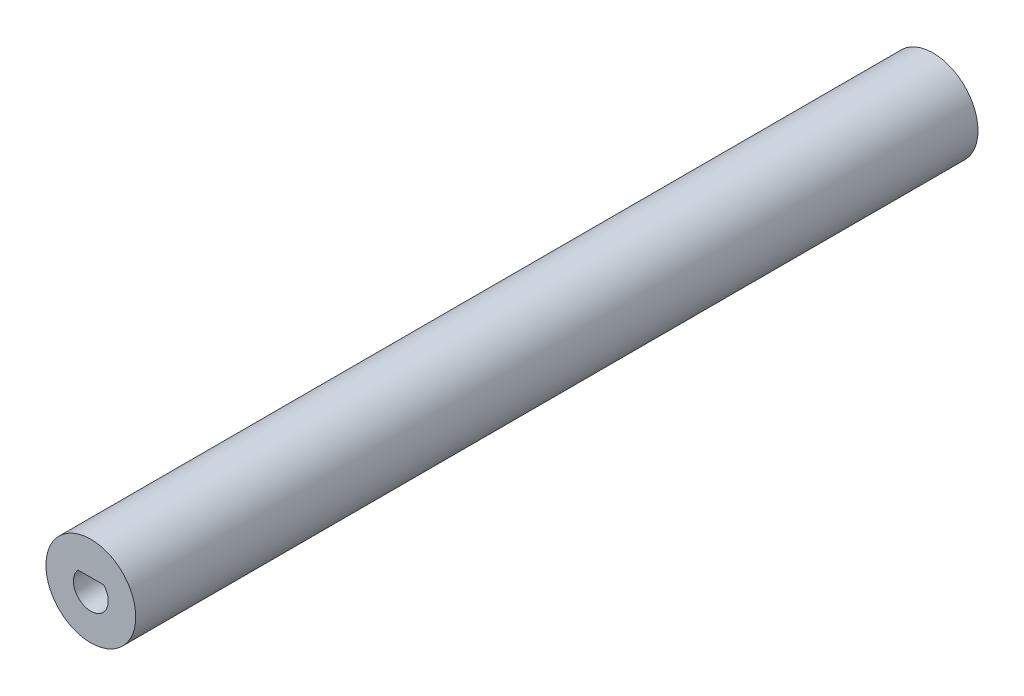
ISO-10303-21;
HEADER;
FILE_DESCRIPTION(('STEP AP214'),'2;1');
FILE_NAME('part.step','',(''),(''),'','','');
FILE_SCHEMA(('AUTOMOTIVE_DESIGN { 1 0 10303 214 1 1 1 1 }'));
ENDSEC;
DATA;
#1=APPLICATION_CONTEXT('core data for automotive mechanical design processes');
#2=APPLICATION_PROTOCOL_DEFINITION('international standard','automotive_design',2000,#1);
#3=PRODUCT_CONTEXT('',#1,'mechanical');
#4=PRODUCT('Part','Part','',(#3));
#5=PRODUCT_RELATED_PRODUCT_CATEGORY('part','',(#4));
#6=PRODUCT_DEFINITION_FORMATION('','',#4);
#7=PRODUCT_DEFINITION_CONTEXT('part definition',#1,'design');
#8=PRODUCT_DEFINITION('design','',#6,#7);
#9=PRODUCT_DEFINITION_SHAPE('','',#8);
#10=(LENGTH_UNIT() NAMED_UNIT(*) SI_UNIT(.MILLI.,.METRE.));
#11=(NAMED_UNIT(*) PLANE_ANGLE_UNIT() SI_UNIT($,.RADIAN.));
#12=(NAMED_UNIT(*) SI_UNIT($,.STERADIAN.) SOLID_ANGLE_UNIT());
#13=UNCERTAINTY_MEASURE_WITH_UNIT(LENGTH_MEASURE(1.E-05),#10,'distance_accuracy_value','');
#14=(GEOMETRIC_REPRESENTATION_CONTEXT(3) GLOBAL_UNCERTAINTY_ASSIGNED_CONTEXT((#13)) GLOBAL_UNIT_ASSIGNED_CONTEXT((#10,
#11,#12)) REPRESENTATION_CONTEXT('',''));
#15=CARTESIAN_POINT('',(0.,0.,0.));
#16=DIRECTION('',(0.,0.,1.));
#17=DIRECTION('',(1.,0.,0.));
#18=AXIS2_PLACEMENT_3D('',#15,#16,#17);
#19=CARTESIAN_POINT('',(0.,0.,75.));
#20=DIRECTION('',(0.,0.,-1.));
#21=DIRECTION('',(-1.,0.,0.));
#22=AXIS2_PLACEMENT_3D('',#19,#20,#21);
#23=CYLINDRICAL_SURFACE('',#22,4.);
#24=CARTESIAN_POINT('',(0.,0.,75.));
#25=DIRECTION('',(0.,0.,1.));
#26=DIRECTION('',(1.,0.,0.));
#27=AXIS2_PLACEMENT_3D('',#24,#25,#26);
#28=CIRCLE('',#27,4.);
#29=CARTESIAN_POINT('',(4.,0.,75.));
#30=VERTEX_POINT('',#29);
#31=EDGE_CURVE('E11',#30,#30,#28,.T.);
#32=ORIENTED_EDGE('',*,*,#31,.F.);
#33=EDGE_LOOP('',(#32));
#34=FACE_BOUND('',#33,.T.);
#35=CARTESIAN_POINT('',(0.,0.,0.));
#36=DIRECTION('',(0.,0.,1.));
#37=DIRECTION('',(1.,0.,0.));
#38=AXIS2_PLACEMENT_3D('',#35,#36,#37);
#39=CIRCLE('',#38,4.);
#40=CARTESIAN_POINT('',(4.,0.,0.));
#41=VERTEX_POINT('',#40);
#42=EDGE_CURVE('E42',#41,#41,#39,.T.);
#43=ORIENTED_EDGE('',*,*,#42,.T.);
#44=EDGE_LOOP('',(#43));
#45=FACE_BOUND('',#44,.T.);
#46=ADVANCED_FACE('F39',(#34,#45),#23,.T.);
#47=CARTESIAN_POINT('',(0.,0.,75.));
#48=DIRECTION('',(0.,0.,1.));
#49=DIRECTION('',(1.,0.,0.));
#50=AXIS2_PLACEMENT_3D('',#47,#48,#49);
#51=PLANE('',#50);
#52=CARTESIAN_POINT('',(0.,0.,75.));
#53=DIRECTION('',(0.,0.,1.));
#54=DIRECTION('',(1.,0.,0.));
#55=AXIS2_PLACEMENT_3D('',#52,#53,#54);
#56=CIRCLE('',#55,1.55);
#57=CARTESIAN_POINT('',(-1.14017542509914,1.05,75.));
#58=VERTEX_POINT('',#57);
#59=CARTESIAN_POINT('',(1.14017542509914,1.05,75.));
#60=VERTEX_POINT('',#59);
#61=EDGE_CURVE('E54',#58,#60,#56,.T.);
#62=ORIENTED_EDGE('',*,*,#61,.F.);
#63=DIRECTION('',(-1.,0.,0.));
#64=VECTOR('',#63,1.);
#65=CARTESIAN_POINT('',(-1.14017542509914,1.05,75.));
#66=LINE('',#65,#64);
#67=EDGE_CURVE('E74',#60,#58,#66,.T.);
#68=ORIENTED_EDGE('',*,*,#67,.F.);
#69=EDGE_LOOP('',(#62,#68));
#70=FACE_BOUND('',#69,.T.);
#71=ORIENTED_EDGE('',*,*,#31,.T.);
#72=EDGE_LOOP('',(#71));
#73=FACE_BOUND('',#72,.T.);
#74=ADVANCED_FACE('F79',(#70,#73),#51,.T.);
#75=CARTESIAN_POINT('',(0.,0.,0.));
#76=DIRECTION('',(0.,0.,1.));
#77=DIRECTION('',(1.,0.,0.));
#78=AXIS2_PLACEMENT_3D('',#75,#76,#77);
#79=PLANE('',#78);
#80=ORIENTED_EDGE('',*,*,#42,.F.);
#81=EDGE_LOOP('',(#80));
#82=FACE_BOUND('',#81,.T.);
#83=ADVANCED_FACE('F103',(#82),#79,.F.);
#84=CARTESIAN_POINT('',(0.,0.,68.));
#85=DIRECTION('',(0.,0.,1.));
#86=DIRECTION('',(1.,0.,0.));
#87=AXIS2_PLACEMENT_3D('',#84,#85,#86);
#88=CYLINDRICAL_SURFACE('',#87,1.55);
#89=ORIENTED_EDGE('',*,*,#61,.T.);
#90=DIRECTION('',(0.,0.,1.));
#91=VECTOR('',#90,1.);
#92=CARTESIAN_POINT('',(1.14017542509914,1.05,68.));
#93=LINE('',#92,#91);
#94=CARTESIAN_POINT('',(1.14017542509914,1.05,68.));
#95=VERTEX_POINT('',#94);
#96=EDGE_CURVE('E71',#95,#60,#93,.T.);
#97=ORIENTED_EDGE('',*,*,#96,.F.);
#98=CARTESIAN_POINT('',(0.,0.,68.));
#99=DIRECTION('',(0.,0.,1.));
#100=DIRECTION('',(1.,0.,0.));
#101=AXIS2_PLACEMENT_3D('',#98,#99,#100);
#102=CIRCLE('',#101,1.55);
#103=CARTESIAN_POINT('',(-1.14017542509914,1.05,68.));
#104=VERTEX_POINT('',#103);
#105=EDGE_CURVE('E68',#104,#95,#102,.T.);
#106=ORIENTED_EDGE('',*,*,#105,.F.);
#107=DIRECTION('',(0.,0.,1.));
#108=VECTOR('',#107,1.);
#109=CARTESIAN_POINT('',(-1.14017542509914,1.05,68.));
#110=LINE('',#109,#108);
#111=EDGE_CURVE('E62',#104,#58,#110,.T.);
#112=ORIENTED_EDGE('',*,*,#111,.T.);
#113=EDGE_LOOP('',(#89,#97,#106,#112));
#114=FACE_BOUND('',#113,.T.);
#115=ADVANCED_FACE('F66',(#114),#88,.F.);
#116=CARTESIAN_POINT('',(-1.14017542509914,1.05,68.));
#117=DIRECTION('',(0.,1.,0.));
#118=DIRECTION('',(0.,0.,1.));
#119=AXIS2_PLACEMENT_3D('',#116,#117,#118);
#120=PLANE('',#119);
#121=ORIENTED_EDGE('',*,*,#67,.T.);
#122=ORIENTED_EDGE('',*,*,#111,.F.);
#123=DIRECTION('',(-1.,0.,0.));
#124=VECTOR('',#123,1.);
#125=CARTESIAN_POINT('',(-1.14017542509914,1.05,68.));
#126=LINE('',#125,#124);
#127=EDGE_CURVE('E84',#95,#104,#126,.T.);
#128=ORIENTED_EDGE('',*,*,#127,.F.);
#129=ORIENTED_EDGE('',*,*,#96,.T.);
#130=EDGE_LOOP('',(#121,#122,#128,#129));
#131=FACE_BOUND('',#130,.T.);
#132=ADVANCED_FACE('F75',(#131),#120,.F.);
#133=CARTESIAN_POINT('',(0.,0.,68.));
#134=DIRECTION('',(0.,0.,1.));
#135=DIRECTION('',(1.,0.,0.));
#136=AXIS2_PLACEMENT_3D('',#133,#134,#135);
#137=PLANE('',#136);
#138=ORIENTED_EDGE('',*,*,#105,.T.);
#139=ORIENTED_EDGE('',*,*,#127,.T.);
#140=EDGE_LOOP('',(#138,#139));
#141=FACE_BOUND('',#140,.T.);
#142=ADVANCED_FACE('F91',(#141),#137,.T.);
#143=CLOSED_SHELL('',(#46,#74,#83,#115,#132,#142));
#144=MANIFOLD_SOLID_BREP('B2',#143);
#145=ADVANCED_BREP_SHAPE_REPRESENTATION('',(#18,#144),#14);
#146=SHAPE_DEFINITION_REPRESENTATION(#9,#145);
ENDSEC;
END-ISO-10303-21;
